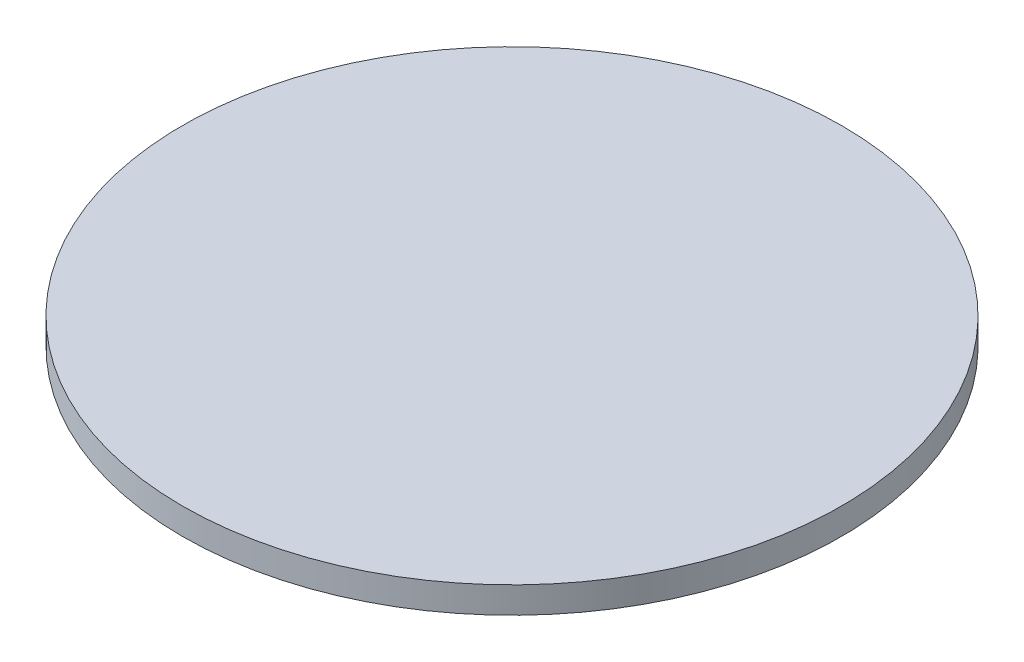
ISO-10303-21;
HEADER;
FILE_DESCRIPTION(('STEP AP214'),'2;1');
FILE_NAME('part.step','',(''),(''),'','','');
FILE_SCHEMA(('AUTOMOTIVE_DESIGN { 1 0 10303 214 1 1 1 1 }'));
ENDSEC;
DATA;
#1=APPLICATION_CONTEXT('core data for automotive mechanical design processes');
#2=APPLICATION_PROTOCOL_DEFINITION('international standard','automotive_design',2000,#1);
#3=PRODUCT_CONTEXT('',#1,'mechanical');
#4=PRODUCT('Part','Part','',(#3));
#5=PRODUCT_RELATED_PRODUCT_CATEGORY('part','',(#4));
#6=PRODUCT_DEFINITION_FORMATION('','',#4);
#7=PRODUCT_DEFINITION_CONTEXT('part definition',#1,'design');
#8=PRODUCT_DEFINITION('design','',#6,#7);
#9=PRODUCT_DEFINITION_SHAPE('','',#8);
#10=(LENGTH_UNIT() NAMED_UNIT(*) SI_UNIT(.MILLI.,.METRE.));
#11=(NAMED_UNIT(*) PLANE_ANGLE_UNIT() SI_UNIT($,.RADIAN.));
#12=(NAMED_UNIT(*) SI_UNIT($,.STERADIAN.) SOLID_ANGLE_UNIT());
#13=UNCERTAINTY_MEASURE_WITH_UNIT(LENGTH_MEASURE(1.E-05),#10,'distance_accuracy_value','');
#14=(GEOMETRIC_REPRESENTATION_CONTEXT(3) GLOBAL_UNCERTAINTY_ASSIGNED_CONTEXT((#13)) GLOBAL_UNIT_ASSIGNED_CONTEXT((#10,
#11,#12)) REPRESENTATION_CONTEXT('',''));
#15=CARTESIAN_POINT('',(0.,0.,0.));
#16=DIRECTION('',(0.,0.,1.));
#17=DIRECTION('',(1.,0.,0.));
#18=AXIS2_PLACEMENT_3D('',#15,#16,#17);
#19=CARTESIAN_POINT('',(0.,3.,0.));
#20=DIRECTION('',(0.,-1.,0.));
#21=DIRECTION('',(0.,0.,-1.));
#22=AXIS2_PLACEMENT_3D('',#19,#20,#21);
#23=CYLINDRICAL_SURFACE('',#22,37.5);
#24=CARTESIAN_POINT('',(0.,3.,0.));
#25=DIRECTION('',(0.,1.,0.));
#26=DIRECTION('',(0.,0.,1.));
#27=AXIS2_PLACEMENT_3D('',#24,#25,#26);
#28=CIRCLE('',#27,37.5);
#29=CARTESIAN_POINT('',(0.,3.,37.5));
#30=VERTEX_POINT('',#29);
#31=EDGE_CURVE('E10',#30,#30,#28,.T.);
#32=ORIENTED_EDGE('',*,*,#31,.F.);
#33=EDGE_LOOP('',(#32));
#34=FACE_BOUND('',#33,.T.);
#35=CARTESIAN_POINT('',(0.,0.,0.));
#36=DIRECTION('',(0.,1.,0.));
#37=DIRECTION('',(0.,0.,1.));
#38=AXIS2_PLACEMENT_3D('',#35,#36,#37);
#39=CIRCLE('',#38,37.5);
#40=CARTESIAN_POINT('',(0.,0.,37.5));
#41=VERTEX_POINT('',#40);
#42=EDGE_CURVE('E38',#41,#41,#39,.T.);
#43=ORIENTED_EDGE('',*,*,#42,.T.);
#44=EDGE_LOOP('',(#43));
#45=FACE_BOUND('',#44,.T.);
#46=ADVANCED_FACE('F35',(#34,#45),#23,.T.);
#47=CARTESIAN_POINT('',(0.,3.,0.));
#48=DIRECTION('',(0.,1.,0.));
#49=DIRECTION('',(0.,0.,1.));
#50=AXIS2_PLACEMENT_3D('',#47,#48,#49);
#51=PLANE('',#50);
#52=ORIENTED_EDGE('',*,*,#31,.T.);
#53=EDGE_LOOP('',(#52));
#54=FACE_BOUND('',#53,.T.);
#55=ADVANCED_FACE('F50',(#54),#51,.T.);
#56=CARTESIAN_POINT('',(0.,0.,0.));
#57=DIRECTION('',(0.,1.,0.));
#58=DIRECTION('',(0.,0.,1.));
#59=AXIS2_PLACEMENT_3D('',#56,#57,#58);
#60=PLANE('',#59);
#61=ORIENTED_EDGE('',*,*,#42,.F.);
#62=EDGE_LOOP('',(#61));
#63=FACE_BOUND('',#62,.T.);
#64=ADVANCED_FACE('F48',(#63),#60,.F.);
#65=CLOSED_SHELL('',(#46,#55,#64));
#66=MANIFOLD_SOLID_BREP('B2',#65);
#67=ADVANCED_BREP_SHAPE_REPRESENTATION('',(#18,#66),#14);
#68=SHAPE_DEFINITION_REPRESENTATION(#9,#67);
ENDSEC;
END-ISO-10303-21;
